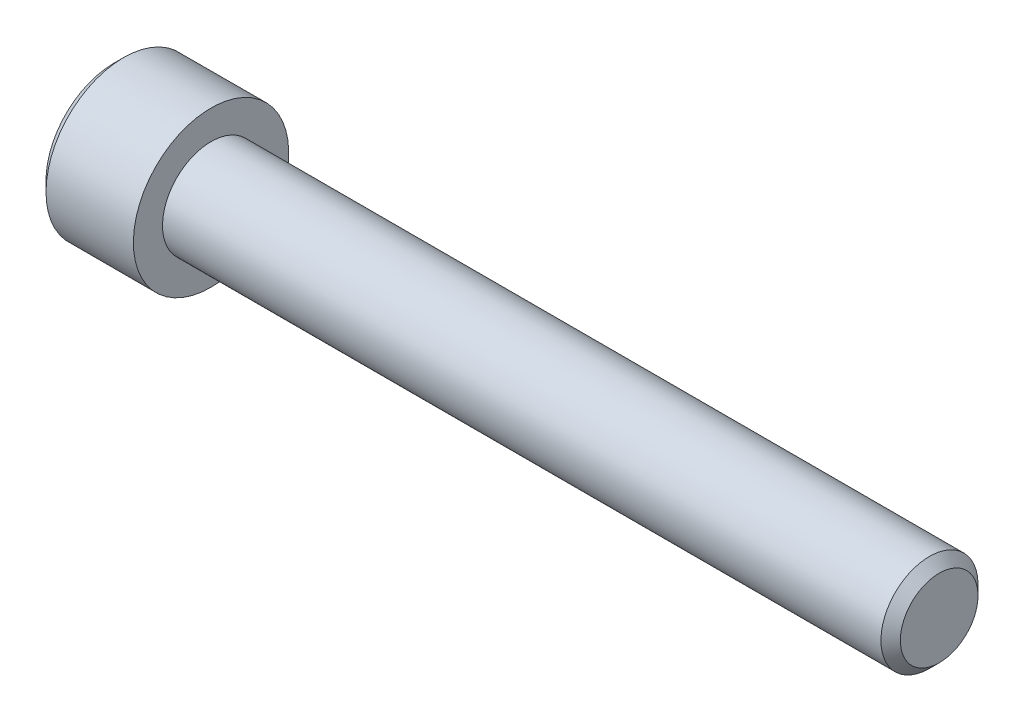
ISO-10303-21;
HEADER;
FILE_DESCRIPTION(('STEP AP214'),'2;1');
FILE_NAME('part.step','',(''),(''),'','','');
FILE_SCHEMA(('AUTOMOTIVE_DESIGN { 1 0 10303 214 1 1 1 1 }'));
ENDSEC;
DATA;
#1=APPLICATION_CONTEXT('core data for automotive mechanical design processes');
#2=APPLICATION_PROTOCOL_DEFINITION('international standard','automotive_design',2000,#1);
#3=PRODUCT_CONTEXT('',#1,'mechanical');
#4=PRODUCT('Part','Part','',(#3));
#5=PRODUCT_RELATED_PRODUCT_CATEGORY('part','',(#4));
#6=PRODUCT_DEFINITION_FORMATION('','',#4);
#7=PRODUCT_DEFINITION_CONTEXT('part definition',#1,'design');
#8=PRODUCT_DEFINITION('design','',#6,#7);
#9=PRODUCT_DEFINITION_SHAPE('','',#8);
#10=(LENGTH_UNIT() NAMED_UNIT(*) SI_UNIT(.MILLI.,.METRE.));
#11=(NAMED_UNIT(*) PLANE_ANGLE_UNIT() SI_UNIT($,.RADIAN.));
#12=(NAMED_UNIT(*) SI_UNIT($,.STERADIAN.) SOLID_ANGLE_UNIT());
#13=UNCERTAINTY_MEASURE_WITH_UNIT(LENGTH_MEASURE(1.E-05),#10,'distance_accuracy_value','');
#14=(GEOMETRIC_REPRESENTATION_CONTEXT(3) GLOBAL_UNCERTAINTY_ASSIGNED_CONTEXT((#13)) GLOBAL_UNIT_ASSIGNED_CONTEXT((#10,
#11,#12)) REPRESENTATION_CONTEXT('',''));
#15=CARTESIAN_POINT('',(0.,0.,0.));
#16=DIRECTION('',(0.,0.,1.));
#17=DIRECTION('',(1.,0.,0.));
#18=AXIS2_PLACEMENT_3D('',#15,#16,#17);
#19=CARTESIAN_POINT('',(-10.,0.,0.));
#20=DIRECTION('',(1.,0.,0.));
#21=DIRECTION('',(0.,1.,0.));
#22=AXIS2_PLACEMENT_3D('',#19,#20,#21);
#23=PLANE('',#22);
#24=CARTESIAN_POINT('',(-10.,0.,0.));
#25=DIRECTION('',(1.,0.,0.));
#26=DIRECTION('',(0.,1.,0.));
#27=AXIS2_PLACEMENT_3D('',#24,#25,#26);
#28=CIRCLE('',#27,6.99999999999999);
#29=CARTESIAN_POINT('',(-10.,6.99999999999998,0.));
#30=VERTEX_POINT('',#29);
#31=EDGE_CURVE('E42',#30,#30,#28,.F.);
#32=ORIENTED_EDGE('',*,*,#31,.T.);
#33=EDGE_LOOP('',(#32));
#34=FACE_BOUND('',#33,.T.);
#35=DIRECTION('',(0.,0.5,0.866025403784439));
#36=VECTOR('',#35,1.);
#37=CARTESIAN_POINT('',(-10.,2.30940107675851,-4.));
#38=LINE('',#37,#36);
#39=CARTESIAN_POINT('',(-10.,2.30940107675851,-4.));
#40=VERTEX_POINT('',#39);
#41=CARTESIAN_POINT('',(-10.,4.61880215351701,0.));
#42=VERTEX_POINT('',#41);
#43=EDGE_CURVE('E49',#40,#42,#38,.T.);
#44=ORIENTED_EDGE('',*,*,#43,.T.);
#45=DIRECTION('',(0.,-0.5,0.866025403784438));
#46=VECTOR('',#45,1.);
#47=CARTESIAN_POINT('',(-10.,4.61880215351701,0.));
#48=LINE('',#47,#46);
#49=CARTESIAN_POINT('',(-10.,2.3094010767585,4.));
#50=VERTEX_POINT('',#49);
#51=EDGE_CURVE('E107',#42,#50,#48,.T.);
#52=ORIENTED_EDGE('',*,*,#51,.T.);
#53=DIRECTION('',(0.,-1.,0.));
#54=VECTOR('',#53,1.);
#55=CARTESIAN_POINT('',(-10.,2.3094010767585,4.));
#56=LINE('',#55,#54);
#57=CARTESIAN_POINT('',(-10.,-2.3094010767585,4.));
#58=VERTEX_POINT('',#57);
#59=EDGE_CURVE('E291',#50,#58,#56,.T.);
#60=ORIENTED_EDGE('',*,*,#59,.T.);
#61=DIRECTION('',(0.,-0.5,-0.866025403784439));
#62=VECTOR('',#61,1.);
#63=CARTESIAN_POINT('',(-10.,-2.3094010767585,4.));
#64=LINE('',#63,#62);
#65=CARTESIAN_POINT('',(-10.,-4.618802153517,0.));
#66=VERTEX_POINT('',#65);
#67=EDGE_CURVE('E288',#58,#66,#64,.T.);
#68=ORIENTED_EDGE('',*,*,#67,.T.);
#69=DIRECTION('',(0.,0.5,-0.866025403784439));
#70=VECTOR('',#69,1.);
#71=CARTESIAN_POINT('',(-10.,-4.618802153517,0.));
#72=LINE('',#71,#70);
#73=CARTESIAN_POINT('',(-10.,-2.3094010767585,-4.));
#74=VERTEX_POINT('',#73);
#75=EDGE_CURVE('E282',#66,#74,#72,.T.);
#76=ORIENTED_EDGE('',*,*,#75,.T.);
#77=DIRECTION('',(0.,1.,0.));
#78=VECTOR('',#77,1.);
#79=CARTESIAN_POINT('',(-10.,-2.3094010767585,-4.));
#80=LINE('',#79,#78);
#81=EDGE_CURVE('E103',#74,#40,#80,.T.);
#82=ORIENTED_EDGE('',*,*,#81,.T.);
#83=EDGE_LOOP('',(#44,#52,#60,#68,#76,#82));
#84=FACE_BOUND('',#83,.T.);
#85=ADVANCED_FACE('F34',(#34,#84),#23,.F.);
#86=CARTESIAN_POINT('',(75.,0.,0.));
#87=DIRECTION('',(-1.,0.,0.));
#88=DIRECTION('',(0.,-1.,0.));
#89=AXIS2_PLACEMENT_3D('',#86,#87,#88);
#90=CYLINDRICAL_SURFACE('',#89,8.);
#91=CARTESIAN_POINT('',(-8.99999999999999,0.,0.));
#92=DIRECTION('',(1.,0.,0.));
#93=DIRECTION('',(0.,1.,0.));
#94=AXIS2_PLACEMENT_3D('',#91,#92,#93);
#95=CIRCLE('',#94,8.);
#96=CARTESIAN_POINT('',(-8.99999999999999,7.99999999999999,0.));
#97=VERTEX_POINT('',#96);
#98=EDGE_CURVE('E11',#97,#97,#95,.T.);
#99=ORIENTED_EDGE('',*,*,#98,.T.);
#100=EDGE_LOOP('',(#99));
#101=FACE_BOUND('',#100,.T.);
#102=CARTESIAN_POINT('',(0.,0.,0.));
#103=DIRECTION('',(-1.,0.,0.));
#104=DIRECTION('',(0.,-1.,0.));
#105=AXIS2_PLACEMENT_3D('',#102,#103,#104);
#106=CIRCLE('',#105,8.);
#107=CARTESIAN_POINT('',(0.,-8.,0.));
#108=VERTEX_POINT('',#107);
#109=EDGE_CURVE('E120',#108,#108,#106,.T.);
#110=ORIENTED_EDGE('',*,*,#109,.T.);
#111=EDGE_LOOP('',(#110));
#112=FACE_BOUND('',#111,.T.);
#113=ADVANCED_FACE('F143',(#101,#112),#90,.T.);
#114=CARTESIAN_POINT('',(0.,7.99999999999999,0.));
#115=DIRECTION('',(-1.,0.,0.));
#116=DIRECTION('',(0.,-1.,0.));
#117=AXIS2_PLACEMENT_3D('',#114,#115,#116);
#118=PLANE('',#117);
#119=ORIENTED_EDGE('',*,*,#109,.F.);
#120=EDGE_LOOP('',(#119));
#121=FACE_BOUND('',#120,.T.);
#122=CARTESIAN_POINT('',(0.,0.,0.));
#123=DIRECTION('',(-1.,0.,0.));
#124=DIRECTION('',(0.,-1.,0.));
#125=AXIS2_PLACEMENT_3D('',#122,#123,#124);
#126=CIRCLE('',#125,5.);
#127=CARTESIAN_POINT('',(0.,-5.00000000000001,0.));
#128=VERTEX_POINT('',#127);
#129=EDGE_CURVE('E112',#128,#128,#126,.T.);
#130=ORIENTED_EDGE('',*,*,#129,.T.);
#131=EDGE_LOOP('',(#130));
#132=FACE_BOUND('',#131,.T.);
#133=ADVANCED_FACE('F148',(#121,#132),#118,.F.);
#134=CARTESIAN_POINT('',(75.,0.,0.));
#135=DIRECTION('',(-1.,0.,0.));
#136=DIRECTION('',(0.,-1.,0.));
#137=AXIS2_PLACEMENT_3D('',#134,#135,#136);
#138=CYLINDRICAL_SURFACE('',#137,5.);
#139=CARTESIAN_POINT('',(74.,0.,0.));
#140=DIRECTION('',(-1.,0.,0.));
#141=DIRECTION('',(0.,-1.,0.));
#142=AXIS2_PLACEMENT_3D('',#139,#140,#141);
#143=CIRCLE('',#142,5.);
#144=CARTESIAN_POINT('',(74.,-5.00000000000001,0.));
#145=VERTEX_POINT('',#144);
#146=EDGE_CURVE('E123',#145,#145,#143,.T.);
#147=ORIENTED_EDGE('',*,*,#146,.T.);
#148=EDGE_LOOP('',(#147));
#149=FACE_BOUND('',#148,.T.);
#150=ORIENTED_EDGE('',*,*,#129,.F.);
#151=EDGE_LOOP('',(#150));
#152=FACE_BOUND('',#151,.T.);
#153=ADVANCED_FACE('F154',(#149,#152),#138,.T.);
#154=CARTESIAN_POINT('',(75.,4.99999999999999,0.));
#155=DIRECTION('',(-1.,0.,0.));
#156=DIRECTION('',(0.,-1.,0.));
#157=AXIS2_PLACEMENT_3D('',#154,#155,#156);
#158=PLANE('',#157);
#159=CARTESIAN_POINT('',(75.,0.,0.));
#160=DIRECTION('',(-1.,0.,0.));
#161=DIRECTION('',(0.,-1.,0.));
#162=AXIS2_PLACEMENT_3D('',#159,#160,#161);
#163=CIRCLE('',#162,3.99999999999999);
#164=CARTESIAN_POINT('',(75.,-4.,0.));
#165=VERTEX_POINT('',#164);
#166=EDGE_CURVE('E126',#165,#165,#163,.F.);
#167=ORIENTED_EDGE('',*,*,#166,.T.);
#168=EDGE_LOOP('',(#167));
#169=FACE_BOUND('',#168,.T.);
#170=ADVANCED_FACE('F158',(#169),#158,.F.);
#171=CARTESIAN_POINT('',(-5.,2.30940107675851,-4.));
#172=DIRECTION('',(0.,-0.866025403784439,0.5));
#173=DIRECTION('',(0.,-0.5,-0.866025403784439));
#174=AXIS2_PLACEMENT_3D('',#171,#172,#173);
#175=PLANE('',#174);
#176=ORIENTED_EDGE('',*,*,#43,.F.);
#177=DIRECTION('',(-1.,0.,0.));
#178=VECTOR('',#177,1.);
#179=CARTESIAN_POINT('',(-5.,2.30940107675851,-4.));
#180=LINE('',#179,#178);
#181=CARTESIAN_POINT('',(-5.,2.30940107675851,-4.));
#182=VERTEX_POINT('',#181);
#183=EDGE_CURVE('E102',#182,#40,#180,.T.);
#184=ORIENTED_EDGE('',*,*,#183,.F.);
#185=DIRECTION('',(0.,0.5,0.866025403784439));
#186=VECTOR('',#185,1.);
#187=CARTESIAN_POINT('',(-5.,2.30940107675851,-4.));
#188=LINE('',#187,#186);
#189=CARTESIAN_POINT('',(-5.,4.61880215351701,0.));
#190=VERTEX_POINT('',#189);
#191=EDGE_CURVE('E93',#182,#190,#188,.T.);
#192=ORIENTED_EDGE('',*,*,#191,.T.);
#193=DIRECTION('',(-1.,0.,0.));
#194=VECTOR('',#193,1.);
#195=CARTESIAN_POINT('',(-5.,4.61880215351701,0.));
#196=LINE('',#195,#194);
#197=EDGE_CURVE('E101',#190,#42,#196,.T.);
#198=ORIENTED_EDGE('',*,*,#197,.T.);
#199=EDGE_LOOP('',(#176,#184,#192,#198));
#200=FACE_BOUND('',#199,.T.);
#201=ADVANCED_FACE('F100',(#200),#175,.T.);
#202=CARTESIAN_POINT('',(-5.,4.61880215351701,0.));
#203=DIRECTION('',(0.,-0.866025403784438,-0.5));
#204=DIRECTION('',(0.,0.5,-0.866025403784439));
#205=AXIS2_PLACEMENT_3D('',#202,#203,#204);
#206=PLANE('',#205);
#207=ORIENTED_EDGE('',*,*,#51,.F.);
#208=ORIENTED_EDGE('',*,*,#197,.F.);
#209=DIRECTION('',(0.,-0.5,0.866025403784438));
#210=VECTOR('',#209,1.);
#211=CARTESIAN_POINT('',(-5.,4.61880215351701,0.));
#212=LINE('',#211,#210);
#213=CARTESIAN_POINT('',(-5.,2.3094010767585,4.));
#214=VERTEX_POINT('',#213);
#215=EDGE_CURVE('E89',#190,#214,#212,.T.);
#216=ORIENTED_EDGE('',*,*,#215,.T.);
#217=DIRECTION('',(-1.,0.,0.));
#218=VECTOR('',#217,1.);
#219=CARTESIAN_POINT('',(-5.,2.3094010767585,4.));
#220=LINE('',#219,#218);
#221=EDGE_CURVE('E109',#214,#50,#220,.T.);
#222=ORIENTED_EDGE('',*,*,#221,.T.);
#223=EDGE_LOOP('',(#207,#208,#216,#222));
#224=FACE_BOUND('',#223,.T.);
#225=ADVANCED_FACE('F105',(#224),#206,.T.);
#226=CARTESIAN_POINT('',(-5.,2.3094010767585,4.));
#227=DIRECTION('',(0.,0.,-1.));
#228=DIRECTION('',(0.,1.,0.));
#229=AXIS2_PLACEMENT_3D('',#226,#227,#228);
#230=PLANE('',#229);
#231=ORIENTED_EDGE('',*,*,#59,.F.);
#232=ORIENTED_EDGE('',*,*,#221,.F.);
#233=DIRECTION('',(0.,-1.,0.));
#234=VECTOR('',#233,1.);
#235=CARTESIAN_POINT('',(-5.,2.3094010767585,4.));
#236=LINE('',#235,#234);
#237=CARTESIAN_POINT('',(-5.,-2.3094010767585,4.));
#238=VERTEX_POINT('',#237);
#239=EDGE_CURVE('E95',#214,#238,#236,.T.);
#240=ORIENTED_EDGE('',*,*,#239,.T.);
#241=DIRECTION('',(-1.,0.,0.));
#242=VECTOR('',#241,1.);
#243=CARTESIAN_POINT('',(-5.,-2.3094010767585,4.));
#244=LINE('',#243,#242);
#245=EDGE_CURVE('E114',#238,#58,#244,.T.);
#246=ORIENTED_EDGE('',*,*,#245,.T.);
#247=EDGE_LOOP('',(#231,#232,#240,#246));
#248=FACE_BOUND('',#247,.T.);
#249=ADVANCED_FACE('F170',(#248),#230,.T.);
#250=CARTESIAN_POINT('',(-5.,-2.3094010767585,4.));
#251=DIRECTION('',(0.,0.866025403784439,-0.5));
#252=DIRECTION('',(0.,0.5,0.866025403784439));
#253=AXIS2_PLACEMENT_3D('',#250,#251,#252);
#254=PLANE('',#253);
#255=ORIENTED_EDGE('',*,*,#67,.F.);
#256=ORIENTED_EDGE('',*,*,#245,.F.);
#257=DIRECTION('',(0.,-0.5,-0.866025403784439));
#258=VECTOR('',#257,1.);
#259=CARTESIAN_POINT('',(-5.,-2.3094010767585,4.));
#260=LINE('',#259,#258);
#261=CARTESIAN_POINT('',(-5.,-4.618802153517,0.));
#262=VERTEX_POINT('',#261);
#263=EDGE_CURVE('E307',#238,#262,#260,.T.);
#264=ORIENTED_EDGE('',*,*,#263,.T.);
#265=DIRECTION('',(-1.,0.,0.));
#266=VECTOR('',#265,1.);
#267=CARTESIAN_POINT('',(-5.,-4.618802153517,0.));
#268=LINE('',#267,#266);
#269=EDGE_CURVE('E298',#262,#66,#268,.T.);
#270=ORIENTED_EDGE('',*,*,#269,.T.);
#271=EDGE_LOOP('',(#255,#256,#264,#270));
#272=FACE_BOUND('',#271,.T.);
#273=ADVANCED_FACE('F173',(#272),#254,.T.);
#274=CARTESIAN_POINT('',(-5.,-4.618802153517,0.));
#275=DIRECTION('',(0.,0.866025403784439,0.5));
#276=DIRECTION('',(0.,-0.5,0.866025403784439));
#277=AXIS2_PLACEMENT_3D('',#274,#275,#276);
#278=PLANE('',#277);
#279=ORIENTED_EDGE('',*,*,#75,.F.);
#280=ORIENTED_EDGE('',*,*,#269,.F.);
#281=DIRECTION('',(0.,0.5,-0.866025403784439));
#282=VECTOR('',#281,1.);
#283=CARTESIAN_POINT('',(-5.,-4.618802153517,0.));
#284=LINE('',#283,#282);
#285=CARTESIAN_POINT('',(-5.,-2.3094010767585,-4.));
#286=VERTEX_POINT('',#285);
#287=EDGE_CURVE('E305',#262,#286,#284,.T.);
#288=ORIENTED_EDGE('',*,*,#287,.T.);
#289=DIRECTION('',(-1.,0.,0.));
#290=VECTOR('',#289,1.);
#291=CARTESIAN_POINT('',(-5.,-2.3094010767585,-4.));
#292=LINE('',#291,#290);
#293=EDGE_CURVE('E281',#286,#74,#292,.T.);
#294=ORIENTED_EDGE('',*,*,#293,.T.);
#295=EDGE_LOOP('',(#279,#280,#288,#294));
#296=FACE_BOUND('',#295,.T.);
#297=ADVANCED_FACE('F177',(#296),#278,.T.);
#298=CARTESIAN_POINT('',(-5.,-2.3094010767585,-4.));
#299=DIRECTION('',(0.,0.,1.));
#300=DIRECTION('',(0.,-1.,0.));
#301=AXIS2_PLACEMENT_3D('',#298,#299,#300);
#302=PLANE('',#301);
#303=ORIENTED_EDGE('',*,*,#81,.F.);
#304=ORIENTED_EDGE('',*,*,#293,.F.);
#305=DIRECTION('',(0.,1.,0.));
#306=VECTOR('',#305,1.);
#307=CARTESIAN_POINT('',(-5.,-2.3094010767585,-4.));
#308=LINE('',#307,#306);
#309=EDGE_CURVE('E296',#286,#182,#308,.T.);
#310=ORIENTED_EDGE('',*,*,#309,.T.);
#311=ORIENTED_EDGE('',*,*,#183,.T.);
#312=EDGE_LOOP('',(#303,#304,#310,#311));
#313=FACE_BOUND('',#312,.T.);
#314=ADVANCED_FACE('F181',(#313),#302,.T.);
#315=CARTESIAN_POINT('',(-5.,4.61880215351701,0.));
#316=DIRECTION('',(1.,0.,0.));
#317=DIRECTION('',(0.,0.,-1.));
#318=AXIS2_PLACEMENT_3D('',#315,#316,#317);
#319=PLANE('',#318);
#320=CARTESIAN_POINT('',(-5.,0.,0.));
#321=DIRECTION('',(1.,0.,0.));
#322=DIRECTION('',(0.,0.,-1.));
#323=AXIS2_PLACEMENT_3D('',#320,#321,#322);
#324=CIRCLE('',#323,3.995);
#325=CARTESIAN_POINT('',(-5.,0.,-3.995));
#326=VERTEX_POINT('',#325);
#327=EDGE_CURVE('E108',#326,#326,#324,.T.);
#328=ORIENTED_EDGE('',*,*,#327,.T.);
#329=EDGE_LOOP('',(#328));
#330=FACE_BOUND('',#329,.T.);
#331=ORIENTED_EDGE('',*,*,#191,.F.);
#332=ORIENTED_EDGE('',*,*,#309,.F.);
#333=ORIENTED_EDGE('',*,*,#287,.F.);
#334=ORIENTED_EDGE('',*,*,#263,.F.);
#335=ORIENTED_EDGE('',*,*,#239,.F.);
#336=ORIENTED_EDGE('',*,*,#215,.F.);
#337=EDGE_LOOP('',(#331,#332,#333,#334,#335,#336));
#338=FACE_BOUND('',#337,.T.);
#339=ADVANCED_FACE('F91',(#330,#338),#319,.F.);
#340=CARTESIAN_POINT('',(-3.92954297623768,0.,0.));
#341=DIRECTION('',(-1.,0.,0.));
#342=DIRECTION('',(0.,-1.,0.));
#343=AXIS2_PLACEMENT_3D('',#340,#341,#342);
#344=CONICAL_SURFACE('',#343,0.,1.30899693899575);
#345=ORIENTED_EDGE('',*,*,#327,.F.);
#346=EDGE_LOOP('',(#345));
#347=FACE_BOUND('',#346,.T.);
#348=CARTESIAN_POINT('',(-3.92954297623768,0.,0.));
#349=VERTEX_POINT('',#348);
#350=VERTEX_LOOP('',#349);
#351=FACE_BOUND('',#350,.T.);
#352=ADVANCED_FACE('F139',(#347,#351),#344,.F.);
#353=CARTESIAN_POINT('',(74.,0.,0.));
#354=DIRECTION('',(-1.,0.,0.));
#355=DIRECTION('',(0.,-1.,0.));
#356=AXIS2_PLACEMENT_3D('',#353,#354,#355);
#357=CONICAL_SURFACE('',#356,5.,0.785398163397446);
#358=ORIENTED_EDGE('',*,*,#166,.F.);
#359=EDGE_LOOP('',(#358));
#360=FACE_BOUND('',#359,.T.);
#361=ORIENTED_EDGE('',*,*,#146,.F.);
#362=EDGE_LOOP('',(#361));
#363=FACE_BOUND('',#362,.T.);
#364=ADVANCED_FACE('F134',(#360,#363),#357,.T.);
#365=CARTESIAN_POINT('',(-9.99999999999999,0.,0.));
#366=DIRECTION('',(1.,0.,0.));
#367=DIRECTION('',(0.,1.,0.));
#368=AXIS2_PLACEMENT_3D('',#365,#366,#367);
#369=CONICAL_SURFACE('',#368,6.99999999999999,0.78539816339745);
#370=ORIENTED_EDGE('',*,*,#98,.F.);
#371=EDGE_LOOP('',(#370));
#372=FACE_BOUND('',#371,.T.);
#373=ORIENTED_EDGE('',*,*,#31,.F.);
#374=EDGE_LOOP('',(#373));
#375=FACE_BOUND('',#374,.T.);
#376=ADVANCED_FACE('F36',(#372,#375),#369,.T.);
#377=CLOSED_SHELL('',(#85,#113,#133,#153,#170,#201,#225,#249,#273,#297,#314,#339,#352,#364,#376));
#378=MANIFOLD_SOLID_BREP('B2',#377);
#379=ADVANCED_BREP_SHAPE_REPRESENTATION('',(#18,#378),#14);
#380=SHAPE_DEFINITION_REPRESENTATION(#9,#379);
ENDSEC;
END-ISO-10303-21;
